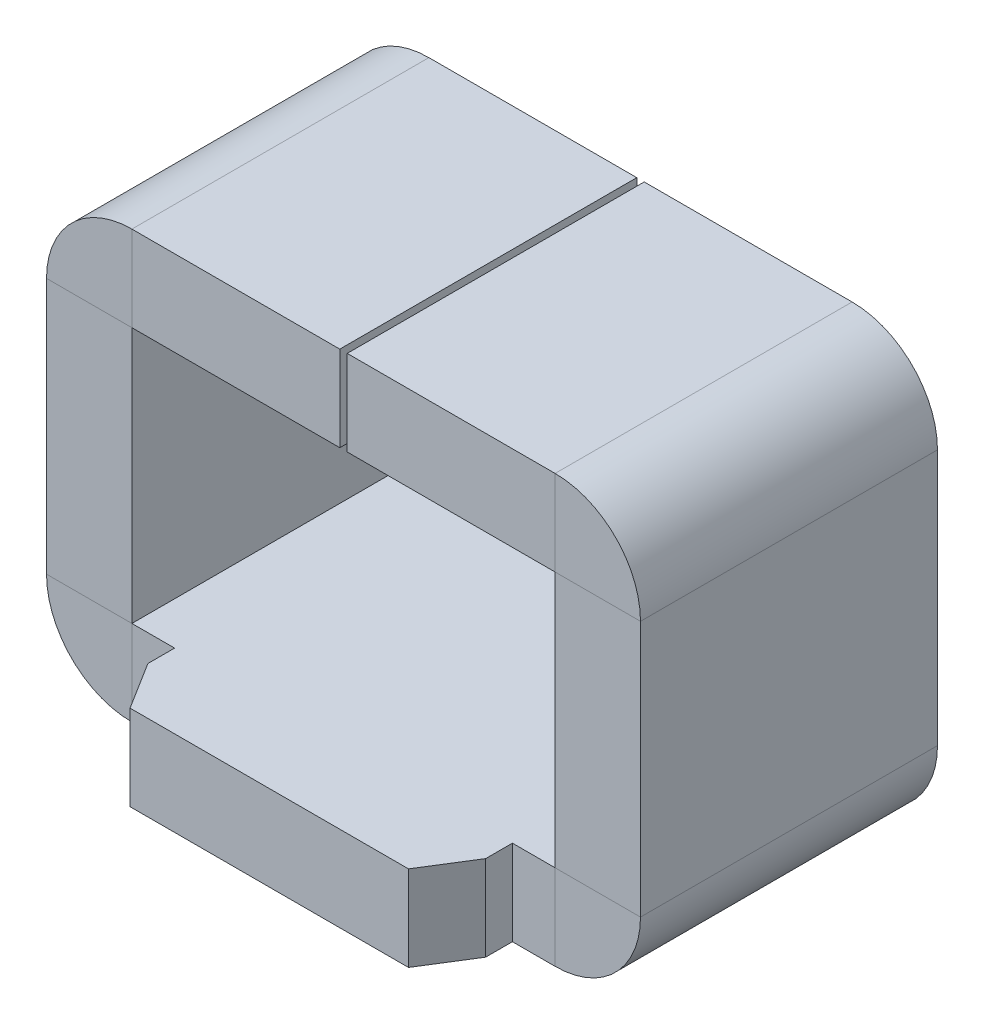
ISO-10303-21;
HEADER;
FILE_DESCRIPTION(('STEP AP214'),'2;1');
FILE_NAME('part.step','',(''),(''),'','','');
FILE_SCHEMA(('AUTOMOTIVE_DESIGN { 1 0 10303 214 1 1 1 1 }'));
ENDSEC;
DATA;
#1=APPLICATION_CONTEXT('core data for automotive mechanical design processes');
#2=APPLICATION_PROTOCOL_DEFINITION('international standard','automotive_design',2000,#1);
#3=PRODUCT_CONTEXT('',#1,'mechanical');
#4=PRODUCT('Part','Part','',(#3));
#5=PRODUCT_RELATED_PRODUCT_CATEGORY('part','',(#4));
#6=PRODUCT_DEFINITION_FORMATION('','',#4);
#7=PRODUCT_DEFINITION_CONTEXT('part definition',#1,'design');
#8=PRODUCT_DEFINITION('design','',#6,#7);
#9=PRODUCT_DEFINITION_SHAPE('','',#8);
#10=(LENGTH_UNIT() NAMED_UNIT(*) SI_UNIT(.MILLI.,.METRE.));
#11=(NAMED_UNIT(*) PLANE_ANGLE_UNIT() SI_UNIT($,.RADIAN.));
#12=(NAMED_UNIT(*) SI_UNIT($,.STERADIAN.) SOLID_ANGLE_UNIT());
#13=UNCERTAINTY_MEASURE_WITH_UNIT(LENGTH_MEASURE(1.E-05),#10,'distance_accuracy_value','');
#14=(GEOMETRIC_REPRESENTATION_CONTEXT(3) GLOBAL_UNCERTAINTY_ASSIGNED_CONTEXT((#13)) GLOBAL_UNIT_ASSIGNED_CONTEXT((#10,
#11,#12)) REPRESENTATION_CONTEXT('',''));
#15=CARTESIAN_POINT('',(0.,0.,0.));
#16=DIRECTION('',(0.,0.,1.));
#17=DIRECTION('',(1.,0.,0.));
#18=AXIS2_PLACEMENT_3D('',#15,#16,#17);
#19=CARTESIAN_POINT('',(1.6,0.229999999999999,0.));
#20=DIRECTION('',(0.,0.,-1.));
#21=DIRECTION('',(-1.,0.,0.));
#22=AXIS2_PLACEMENT_3D('',#19,#20,#21);
#23=PLANE('',#22);
#24=DIRECTION('',(-1.,0.,0.));
#25=VECTOR('',#24,1.);
#26=CARTESIAN_POINT('',(1.6,0.919999999999998,0.));
#27=LINE('',#26,#25);
#28=CARTESIAN_POINT('',(1.6,0.919999999999998,0.));
#29=VERTEX_POINT('',#28);
#30=CARTESIAN_POINT('',(1.37,0.920000000000001,0.));
#31=VERTEX_POINT('',#30);
#32=EDGE_CURVE('E352',#29,#31,#27,.T.);
#33=ORIENTED_EDGE('',*,*,#32,.T.);
#34=DIRECTION('',(0.,1.,0.));
#35=VECTOR('',#34,1.);
#36=CARTESIAN_POINT('',(1.37,0.23,0.));
#37=LINE('',#36,#35);
#38=CARTESIAN_POINT('',(1.37,0.23,0.));
#39=VERTEX_POINT('',#38);
#40=EDGE_CURVE('E452',#31,#39,#37,.F.);
#41=ORIENTED_EDGE('',*,*,#40,.T.);
#42=DIRECTION('',(-1.,0.,0.));
#43=VECTOR('',#42,1.);
#44=CARTESIAN_POINT('',(1.6,0.229999999999999,0.));
#45=LINE('',#44,#43);
#46=CARTESIAN_POINT('',(1.6,0.229999999999999,0.));
#47=VERTEX_POINT('',#46);
#48=EDGE_CURVE('E453',#47,#39,#45,.T.);
#49=ORIENTED_EDGE('',*,*,#48,.F.);
#50=DIRECTION('',(0.,-1.,0.));
#51=VECTOR('',#50,1.);
#52=CARTESIAN_POINT('',(1.6,0.,0.));
#53=LINE('',#52,#51);
#54=EDGE_CURVE('E466',#29,#47,#53,.T.);
#55=ORIENTED_EDGE('',*,*,#54,.F.);
#56=EDGE_LOOP('',(#33,#41,#49,#55));
#57=FACE_BOUND('',#56,.T.);
#58=ADVANCED_FACE('F119',(#57),#23,.F.);
#59=CARTESIAN_POINT('',(1.6,1.15,-0.8));
#60=DIRECTION('',(0.,0.,1.));
#61=DIRECTION('',(1.,0.,0.));
#62=AXIS2_PLACEMENT_3D('',#59,#60,#61);
#63=PLANE('',#62);
#64=DIRECTION('',(-1.,0.,0.));
#65=VECTOR('',#64,1.);
#66=CARTESIAN_POINT('',(1.6,0.919999999999998,-0.8));
#67=LINE('',#66,#65);
#68=CARTESIAN_POINT('',(1.6,0.92,-0.8));
#69=VERTEX_POINT('',#68);
#70=CARTESIAN_POINT('',(1.37,0.920000000000001,-0.8));
#71=VERTEX_POINT('',#70);
#72=EDGE_CURVE('E347',#69,#71,#67,.T.);
#73=ORIENTED_EDGE('',*,*,#72,.F.);
#74=DIRECTION('',(0.,1.,0.));
#75=VECTOR('',#74,1.);
#76=CARTESIAN_POINT('',(1.6,0.,-0.8));
#77=LINE('',#76,#75);
#78=CARTESIAN_POINT('',(1.6,0.229999999999999,-0.8));
#79=VERTEX_POINT('',#78);
#80=EDGE_CURVE('E460',#79,#69,#77,.T.);
#81=ORIENTED_EDGE('',*,*,#80,.F.);
#82=DIRECTION('',(-1.,0.,0.));
#83=VECTOR('',#82,1.);
#84=CARTESIAN_POINT('',(1.6,0.229999999999999,-0.8));
#85=LINE('',#84,#83);
#86=CARTESIAN_POINT('',(1.37,0.23,-0.8));
#87=VERTEX_POINT('',#86);
#88=EDGE_CURVE('E457',#79,#87,#85,.T.);
#89=ORIENTED_EDGE('',*,*,#88,.T.);
#90=DIRECTION('',(0.,-1.,0.));
#91=VECTOR('',#90,1.);
#92=CARTESIAN_POINT('',(1.37,1.15,-0.8));
#93=LINE('',#92,#91);
#94=EDGE_CURVE('E468',#87,#71,#93,.F.);
#95=ORIENTED_EDGE('',*,*,#94,.T.);
#96=EDGE_LOOP('',(#73,#81,#89,#95));
#97=FACE_BOUND('',#96,.T.);
#98=ADVANCED_FACE('F701',(#97),#63,.F.);
#99=CARTESIAN_POINT('',(1.6,0.,0.));
#100=DIRECTION('',(-1.,0.,0.));
#101=DIRECTION('',(0.,-1.,0.));
#102=AXIS2_PLACEMENT_3D('',#99,#100,#101);
#103=PLANE('',#102);
#104=DIRECTION('',(0.,0.,-1.));
#105=VECTOR('',#104,1.);
#106=CARTESIAN_POINT('',(1.6,0.919999999999998,0.));
#107=LINE('',#106,#105);
#108=EDGE_CURVE('E349',#29,#69,#107,.T.);
#109=ORIENTED_EDGE('',*,*,#108,.F.);
#110=ORIENTED_EDGE('',*,*,#54,.T.);
#111=DIRECTION('',(0.,0.,-1.));
#112=VECTOR('',#111,1.);
#113=CARTESIAN_POINT('',(1.6,0.229999999999999,0.));
#114=LINE('',#113,#112);
#115=EDGE_CURVE('E463',#47,#79,#114,.T.);
#116=ORIENTED_EDGE('',*,*,#115,.T.);
#117=ORIENTED_EDGE('',*,*,#80,.T.);
#118=EDGE_LOOP('',(#109,#110,#116,#117));
#119=FACE_BOUND('',#118,.T.);
#120=ADVANCED_FACE('F707',(#119),#103,.F.);
#121=CARTESIAN_POINT('',(1.37,0.,0.));
#122=DIRECTION('',(-1.,0.,0.));
#123=DIRECTION('',(0.,-1.,0.));
#124=AXIS2_PLACEMENT_3D('',#121,#122,#123);
#125=PLANE('',#124);
#126=ORIENTED_EDGE('',*,*,#40,.F.);
#127=DIRECTION('',(0.,0.,1.));
#128=VECTOR('',#127,1.);
#129=CARTESIAN_POINT('',(1.37,0.920000000000001,-0.8));
#130=LINE('',#129,#128);
#131=EDGE_CURVE('E338',#31,#71,#130,.F.);
#132=ORIENTED_EDGE('',*,*,#131,.T.);
#133=ORIENTED_EDGE('',*,*,#94,.F.);
#134=DIRECTION('',(0.,0.,1.));
#135=VECTOR('',#134,1.);
#136=CARTESIAN_POINT('',(1.37,0.23,0.));
#137=LINE('',#136,#135);
#138=EDGE_CURVE('E471',#39,#87,#137,.F.);
#139=ORIENTED_EDGE('',*,*,#138,.F.);
#140=EDGE_LOOP('',(#126,#132,#133,#139));
#141=FACE_BOUND('',#140,.T.);
#142=ADVANCED_FACE('F781',(#141),#125,.T.);
#143=CARTESIAN_POINT('',(0.,0.229999999999999,-0.8));
#144=DIRECTION('',(0.,0.,1.));
#145=DIRECTION('',(1.,0.,0.));
#146=AXIS2_PLACEMENT_3D('',#143,#144,#145);
#147=PLANE('',#146);
#148=DIRECTION('',(1.,0.,0.));
#149=VECTOR('',#148,1.);
#150=CARTESIAN_POINT('',(0.,0.919999999999999,-0.8));
#151=LINE('',#150,#149);
#152=CARTESIAN_POINT('',(0.,0.919999999999999,-0.8));
#153=VERTEX_POINT('',#152);
#154=CARTESIAN_POINT('',(0.229999999999998,0.920000000000001,-0.8));
#155=VERTEX_POINT('',#154);
#156=EDGE_CURVE('E397',#153,#155,#151,.T.);
#157=ORIENTED_EDGE('',*,*,#156,.T.);
#158=DIRECTION('',(0.,1.,0.));
#159=VECTOR('',#158,1.);
#160=CARTESIAN_POINT('',(0.23,0.23,-0.8));
#161=LINE('',#160,#159);
#162=CARTESIAN_POINT('',(0.23,0.23,-0.8));
#163=VERTEX_POINT('',#162);
#164=EDGE_CURVE('E403',#155,#163,#161,.F.);
#165=ORIENTED_EDGE('',*,*,#164,.T.);
#166=DIRECTION('',(1.,0.,0.));
#167=VECTOR('',#166,1.);
#168=CARTESIAN_POINT('',(0.,0.229999999999999,-0.8));
#169=LINE('',#168,#167);
#170=CARTESIAN_POINT('',(0.,0.229999999999999,-0.8));
#171=VERTEX_POINT('',#170);
#172=EDGE_CURVE('E404',#171,#163,#169,.T.);
#173=ORIENTED_EDGE('',*,*,#172,.F.);
#174=DIRECTION('',(0.,-1.,0.));
#175=VECTOR('',#174,1.);
#176=CARTESIAN_POINT('',(0.,0.,-0.8));
#177=LINE('',#176,#175);
#178=EDGE_CURVE('E417',#153,#171,#177,.T.);
#179=ORIENTED_EDGE('',*,*,#178,.F.);
#180=EDGE_LOOP('',(#157,#165,#173,#179));
#181=FACE_BOUND('',#180,.T.);
#182=ADVANCED_FACE('F686',(#181),#147,.F.);
#183=CARTESIAN_POINT('',(0.,1.15,0.));
#184=DIRECTION('',(0.,0.,-1.));
#185=DIRECTION('',(-1.,0.,0.));
#186=AXIS2_PLACEMENT_3D('',#183,#184,#185);
#187=PLANE('',#186);
#188=DIRECTION('',(1.,0.,0.));
#189=VECTOR('',#188,1.);
#190=CARTESIAN_POINT('',(0.,0.919999999999999,0.));
#191=LINE('',#190,#189);
#192=CARTESIAN_POINT('',(0.,0.92,0.));
#193=VERTEX_POINT('',#192);
#194=CARTESIAN_POINT('',(0.229999999999998,0.920000000000001,0.));
#195=VERTEX_POINT('',#194);
#196=EDGE_CURVE('E362',#193,#195,#191,.T.);
#197=ORIENTED_EDGE('',*,*,#196,.F.);
#198=DIRECTION('',(0.,1.,0.));
#199=VECTOR('',#198,1.);
#200=CARTESIAN_POINT('',(0.,0.,0.));
#201=LINE('',#200,#199);
#202=CARTESIAN_POINT('',(0.,0.229999999999999,0.));
#203=VERTEX_POINT('',#202);
#204=EDGE_CURVE('E411',#203,#193,#201,.T.);
#205=ORIENTED_EDGE('',*,*,#204,.F.);
#206=DIRECTION('',(1.,0.,0.));
#207=VECTOR('',#206,1.);
#208=CARTESIAN_POINT('',(0.,0.229999999999999,0.));
#209=LINE('',#208,#207);
#210=CARTESIAN_POINT('',(0.23,0.23,0.));
#211=VERTEX_POINT('',#210);
#212=EDGE_CURVE('E408',#203,#211,#209,.T.);
#213=ORIENTED_EDGE('',*,*,#212,.T.);
#214=DIRECTION('',(0.,-1.,0.));
#215=VECTOR('',#214,1.);
#216=CARTESIAN_POINT('',(0.229999999999997,1.15,0.));
#217=LINE('',#216,#215);
#218=EDGE_CURVE('E419',#211,#195,#217,.F.);
#219=ORIENTED_EDGE('',*,*,#218,.T.);
#220=EDGE_LOOP('',(#197,#205,#213,#219));
#221=FACE_BOUND('',#220,.T.);
#222=ADVANCED_FACE('F655',(#221),#187,.F.);
#223=CARTESIAN_POINT('',(0.,0.,0.));
#224=DIRECTION('',(1.,0.,0.));
#225=DIRECTION('',(0.,1.,0.));
#226=AXIS2_PLACEMENT_3D('',#223,#224,#225);
#227=PLANE('',#226);
#228=DIRECTION('',(0.,0.,1.));
#229=VECTOR('',#228,1.);
#230=CARTESIAN_POINT('',(0.,0.919999999999999,0.));
#231=LINE('',#230,#229);
#232=EDGE_CURVE('E394',#153,#193,#231,.T.);
#233=ORIENTED_EDGE('',*,*,#232,.F.);
#234=ORIENTED_EDGE('',*,*,#178,.T.);
#235=DIRECTION('',(0.,0.,1.));
#236=VECTOR('',#235,1.);
#237=CARTESIAN_POINT('',(0.,0.229999999999999,0.));
#238=LINE('',#237,#236);
#239=EDGE_CURVE('E414',#171,#203,#238,.T.);
#240=ORIENTED_EDGE('',*,*,#239,.T.);
#241=ORIENTED_EDGE('',*,*,#204,.T.);
#242=EDGE_LOOP('',(#233,#234,#240,#241));
#243=FACE_BOUND('',#242,.T.);
#244=ADVANCED_FACE('F684',(#243),#227,.F.);
#245=CARTESIAN_POINT('',(0.230000000000001,0.,0.));
#246=DIRECTION('',(1.,0.,0.));
#247=DIRECTION('',(0.,1.,0.));
#248=AXIS2_PLACEMENT_3D('',#245,#246,#247);
#249=PLANE('',#248);
#250=ORIENTED_EDGE('',*,*,#164,.F.);
#251=DIRECTION('',(0.,0.,-1.));
#252=VECTOR('',#251,1.);
#253=CARTESIAN_POINT('',(0.229999999999998,0.920000000000001,0.));
#254=LINE('',#253,#252);
#255=EDGE_CURVE('E383',#155,#195,#254,.F.);
#256=ORIENTED_EDGE('',*,*,#255,.T.);
#257=ORIENTED_EDGE('',*,*,#218,.F.);
#258=DIRECTION('',(0.,0.,-1.));
#259=VECTOR('',#258,1.);
#260=CARTESIAN_POINT('',(0.23,0.23,-0.8));
#261=LINE('',#260,#259);
#262=EDGE_CURVE('E422',#163,#211,#261,.F.);
#263=ORIENTED_EDGE('',*,*,#262,.F.);
#264=EDGE_LOOP('',(#250,#256,#257,#263));
#265=FACE_BOUND('',#264,.T.);
#266=ADVANCED_FACE('F656',(#265),#249,.T.);
#267=CARTESIAN_POINT('',(0.,0.23,0.));
#268=DIRECTION('',(0.,-1.,0.));
#269=DIRECTION('',(0.,0.,-1.));
#270=AXIS2_PLACEMENT_3D('',#267,#268,#269);
#271=PLANE('',#270);
#272=DIRECTION('',(0.,0.,-1.));
#273=VECTOR('',#272,1.);
#274=CARTESIAN_POINT('',(0.345,0.23,0.115));
#275=LINE('',#274,#273);
#276=CARTESIAN_POINT('',(0.345,0.23,0.0719999999999995));
#277=VERTEX_POINT('',#276);
#278=CARTESIAN_POINT('',(0.345,0.23,0.));
#279=VERTEX_POINT('',#278);
#280=EDGE_CURVE('E438',#277,#279,#275,.T.);
#281=ORIENTED_EDGE('',*,*,#280,.F.);
#282=DIRECTION('',(0.529998940003179,0.,0.847998304005088));
#283=VECTOR('',#282,1.);
#284=CARTESIAN_POINT('',(0.425,0.23,0.2));
#285=LINE('',#284,#283);
#286=CARTESIAN_POINT('',(0.425,0.23,0.2));
#287=VERTEX_POINT('',#286);
#288=EDGE_CURVE('E503',#277,#287,#285,.T.);
#289=ORIENTED_EDGE('',*,*,#288,.T.);
#290=DIRECTION('',(1.,0.,0.));
#291=VECTOR('',#290,1.);
#292=CARTESIAN_POINT('',(1.175,0.23,0.2));
#293=LINE('',#292,#291);
#294=CARTESIAN_POINT('',(1.175,0.23,0.2));
#295=VERTEX_POINT('',#294);
#296=EDGE_CURVE('E506',#287,#295,#293,.T.);
#297=ORIENTED_EDGE('',*,*,#296,.T.);
#298=DIRECTION('',(0.52999894000318,0.,-0.847998304005088));
#299=VECTOR('',#298,1.);
#300=CARTESIAN_POINT('',(1.3,0.23,0.));
#301=LINE('',#300,#299);
#302=CARTESIAN_POINT('',(1.255,0.23,0.0719999999999996));
#303=VERTEX_POINT('',#302);
#304=EDGE_CURVE('E508',#295,#303,#301,.T.);
#305=ORIENTED_EDGE('',*,*,#304,.T.);
#306=DIRECTION('',(0.,0.,1.));
#307=VECTOR('',#306,1.);
#308=CARTESIAN_POINT('',(1.255,0.23,0.));
#309=LINE('',#308,#307);
#310=CARTESIAN_POINT('',(1.255,0.23,0.));
#311=VERTEX_POINT('',#310);
#312=EDGE_CURVE('E493',#311,#303,#309,.T.);
#313=ORIENTED_EDGE('',*,*,#312,.F.);
#314=DIRECTION('',(1.,0.,0.));
#315=VECTOR('',#314,1.);
#316=CARTESIAN_POINT('',(1.3,0.23,0.));
#317=LINE('',#316,#315);
#318=EDGE_CURVE('E511',#311,#39,#317,.T.);
#319=ORIENTED_EDGE('',*,*,#318,.T.);
#320=ORIENTED_EDGE('',*,*,#138,.T.);
#321=DIRECTION('',(-1.,0.,0.));
#322=VECTOR('',#321,1.);
#323=CARTESIAN_POINT('',(1.3,0.23,-0.8));
#324=LINE('',#323,#322);
#325=CARTESIAN_POINT('',(1.255,0.23,-0.8));
#326=VERTEX_POINT('',#325);
#327=EDGE_CURVE('E514',#87,#326,#324,.T.);
#328=ORIENTED_EDGE('',*,*,#327,.T.);
#329=DIRECTION('',(0.,0.,1.));
#330=VECTOR('',#329,1.);
#331=CARTESIAN_POINT('',(1.255,0.23,-0.915));
#332=LINE('',#331,#330);
#333=CARTESIAN_POINT('',(1.255,0.23,-0.872));
#334=VERTEX_POINT('',#333);
#335=EDGE_CURVE('E488',#334,#326,#332,.T.);
#336=ORIENTED_EDGE('',*,*,#335,.F.);
#337=DIRECTION('',(-0.52999894000318,0.,-0.847998304005088));
#338=VECTOR('',#337,1.);
#339=CARTESIAN_POINT('',(1.3,0.23,-0.8));
#340=LINE('',#339,#338);
#341=CARTESIAN_POINT('',(1.175,0.23,-1.));
#342=VERTEX_POINT('',#341);
#343=EDGE_CURVE('E516',#334,#342,#340,.T.);
#344=ORIENTED_EDGE('',*,*,#343,.T.);
#345=DIRECTION('',(-1.,0.,0.));
#346=VECTOR('',#345,1.);
#347=CARTESIAN_POINT('',(1.175,0.23,-1.));
#348=LINE('',#347,#346);
#349=CARTESIAN_POINT('',(0.425,0.23,-1.));
#350=VERTEX_POINT('',#349);
#351=EDGE_CURVE('E518',#342,#350,#348,.T.);
#352=ORIENTED_EDGE('',*,*,#351,.T.);
#353=DIRECTION('',(-0.52999894000318,0.,0.847998304005088));
#354=VECTOR('',#353,1.);
#355=CARTESIAN_POINT('',(0.425,0.23,-1.));
#356=LINE('',#355,#354);
#357=CARTESIAN_POINT('',(0.345,0.23,-0.872));
#358=VERTEX_POINT('',#357);
#359=EDGE_CURVE('E520',#350,#358,#356,.T.);
#360=ORIENTED_EDGE('',*,*,#359,.T.);
#361=DIRECTION('',(0.,0.,-1.));
#362=VECTOR('',#361,1.);
#363=CARTESIAN_POINT('',(0.345,0.23,-0.8));
#364=LINE('',#363,#362);
#365=CARTESIAN_POINT('',(0.345,0.23,-0.8));
#366=VERTEX_POINT('',#365);
#367=EDGE_CURVE('E442',#366,#358,#364,.T.);
#368=ORIENTED_EDGE('',*,*,#367,.F.);
#369=DIRECTION('',(-1.,0.,0.));
#370=VECTOR('',#369,1.);
#371=CARTESIAN_POINT('',(0.,0.23,-0.8));
#372=LINE('',#371,#370);
#373=EDGE_CURVE('E523',#366,#163,#372,.T.);
#374=ORIENTED_EDGE('',*,*,#373,.T.);
#375=ORIENTED_EDGE('',*,*,#262,.T.);
#376=DIRECTION('',(1.,0.,0.));
#377=VECTOR('',#376,1.);
#378=CARTESIAN_POINT('',(0.,0.23,0.));
#379=LINE('',#378,#377);
#380=EDGE_CURVE('E134',#211,#279,#379,.T.);
#381=ORIENTED_EDGE('',*,*,#380,.T.);
#382=EDGE_LOOP('',(#281,#289,#297,#305,#313,#319,#320,#328,#336,#344,#352,#360,#368,#374,#375,#381));
#383=FACE_BOUND('',#382,.T.);
#384=ADVANCED_FACE('F593',(#383),#271,.F.);
#385=CARTESIAN_POINT('',(0.,0.,0.));
#386=DIRECTION('',(0.,-1.,0.));
#387=DIRECTION('',(0.,0.,-1.));
#388=AXIS2_PLACEMENT_3D('',#385,#386,#387);
#389=PLANE('',#388);
#390=DIRECTION('',(0.529998940003179,0.,0.847998304005088));
#391=VECTOR('',#390,1.);
#392=CARTESIAN_POINT('',(0.425,0.,0.2));
#393=LINE('',#392,#391);
#394=CARTESIAN_POINT('',(0.345,0.,0.0719999999999995));
#395=VERTEX_POINT('',#394);
#396=CARTESIAN_POINT('',(0.425,0.,0.2));
#397=VERTEX_POINT('',#396);
#398=EDGE_CURVE('E528',#395,#397,#393,.T.);
#399=ORIENTED_EDGE('',*,*,#398,.F.);
#400=DIRECTION('',(0.,0.,-1.));
#401=VECTOR('',#400,1.);
#402=CARTESIAN_POINT('',(0.345,0.,0.));
#403=LINE('',#402,#401);
#404=CARTESIAN_POINT('',(0.345,0.,0.));
#405=VERTEX_POINT('',#404);
#406=EDGE_CURVE('E450',#395,#405,#403,.T.);
#407=ORIENTED_EDGE('',*,*,#406,.T.);
#408=DIRECTION('',(1.,0.,0.));
#409=VECTOR('',#408,1.);
#410=CARTESIAN_POINT('',(0.,0.,0.));
#411=LINE('',#410,#409);
#412=CARTESIAN_POINT('',(0.23,0.,0.));
#413=VERTEX_POINT('',#412);
#414=EDGE_CURVE('E142',#413,#405,#411,.T.);
#415=ORIENTED_EDGE('',*,*,#414,.F.);
#416=DIRECTION('',(0.,0.,1.));
#417=VECTOR('',#416,1.);
#418=CARTESIAN_POINT('',(0.230000000000002,0.,0.));
#419=LINE('',#418,#417);
#420=CARTESIAN_POINT('',(0.230000000000002,0.,-0.8));
#421=VERTEX_POINT('',#420);
#422=EDGE_CURVE('E426',#421,#413,#419,.T.);
#423=ORIENTED_EDGE('',*,*,#422,.F.);
#424=DIRECTION('',(-1.,0.,0.));
#425=VECTOR('',#424,1.);
#426=CARTESIAN_POINT('',(0.,0.,-0.8));
#427=LINE('',#426,#425);
#428=CARTESIAN_POINT('',(0.345,0.,-0.8));
#429=VERTEX_POINT('',#428);
#430=EDGE_CURVE('E504',#429,#421,#427,.T.);
#431=ORIENTED_EDGE('',*,*,#430,.F.);
#432=DIRECTION('',(0.,0.,-1.));
#433=VECTOR('',#432,1.);
#434=CARTESIAN_POINT('',(0.345,0.,0.));
#435=LINE('',#434,#433);
#436=CARTESIAN_POINT('',(0.345,0.,-0.872));
#437=VERTEX_POINT('',#436);
#438=EDGE_CURVE('E440',#429,#437,#435,.T.);
#439=ORIENTED_EDGE('',*,*,#438,.T.);
#440=DIRECTION('',(-0.52999894000318,0.,0.847998304005088));
#441=VECTOR('',#440,1.);
#442=CARTESIAN_POINT('',(0.425,0.,-1.));
#443=LINE('',#442,#441);
#444=CARTESIAN_POINT('',(0.425,0.,-1.));
#445=VERTEX_POINT('',#444);
#446=EDGE_CURVE('E543',#445,#437,#443,.T.);
#447=ORIENTED_EDGE('',*,*,#446,.F.);
#448=DIRECTION('',(-1.,0.,0.));
#449=VECTOR('',#448,1.);
#450=CARTESIAN_POINT('',(1.175,0.,-1.));
#451=LINE('',#450,#449);
#452=CARTESIAN_POINT('',(1.175,0.,-1.));
#453=VERTEX_POINT('',#452);
#454=EDGE_CURVE('E541',#453,#445,#451,.T.);
#455=ORIENTED_EDGE('',*,*,#454,.F.);
#456=DIRECTION('',(-0.52999894000318,0.,-0.847998304005088));
#457=VECTOR('',#456,1.);
#458=CARTESIAN_POINT('',(1.3,0.,-0.8));
#459=LINE('',#458,#457);
#460=CARTESIAN_POINT('',(1.255,0.,-0.872));
#461=VERTEX_POINT('',#460);
#462=EDGE_CURVE('E539',#461,#453,#459,.T.);
#463=ORIENTED_EDGE('',*,*,#462,.F.);
#464=DIRECTION('',(0.,0.,1.));
#465=VECTOR('',#464,1.);
#466=CARTESIAN_POINT('',(1.255,0.,0.));
#467=LINE('',#466,#465);
#468=CARTESIAN_POINT('',(1.255,0.,-0.8));
#469=VERTEX_POINT('',#468);
#470=EDGE_CURVE('E562',#461,#469,#467,.T.);
#471=ORIENTED_EDGE('',*,*,#470,.T.);
#472=DIRECTION('',(-1.,0.,0.));
#473=VECTOR('',#472,1.);
#474=CARTESIAN_POINT('',(1.3,0.,-0.8));
#475=LINE('',#474,#473);
#476=CARTESIAN_POINT('',(1.37,0.,-0.8));
#477=VERTEX_POINT('',#476);
#478=EDGE_CURVE('E537',#477,#469,#475,.T.);
#479=ORIENTED_EDGE('',*,*,#478,.F.);
#480=DIRECTION('',(0.,0.,-1.));
#481=VECTOR('',#480,1.);
#482=CARTESIAN_POINT('',(1.37,0.,0.));
#483=LINE('',#482,#481);
#484=CARTESIAN_POINT('',(1.37,0.,0.));
#485=VERTEX_POINT('',#484);
#486=EDGE_CURVE('E476',#485,#477,#483,.T.);
#487=ORIENTED_EDGE('',*,*,#486,.F.);
#488=DIRECTION('',(1.,0.,0.));
#489=VECTOR('',#488,1.);
#490=CARTESIAN_POINT('',(1.3,0.,0.));
#491=LINE('',#490,#489);
#492=CARTESIAN_POINT('',(1.255,0.,0.));
#493=VERTEX_POINT('',#492);
#494=EDGE_CURVE('E535',#493,#485,#491,.T.);
#495=ORIENTED_EDGE('',*,*,#494,.F.);
#496=DIRECTION('',(0.,0.,1.));
#497=VECTOR('',#496,1.);
#498=CARTESIAN_POINT('',(1.255,0.,0.));
#499=LINE('',#498,#497);
#500=CARTESIAN_POINT('',(1.255,0.,0.0719999999999996));
#501=VERTEX_POINT('',#500);
#502=EDGE_CURVE('E559',#493,#501,#499,.T.);
#503=ORIENTED_EDGE('',*,*,#502,.T.);
#504=DIRECTION('',(0.52999894000318,0.,-0.847998304005088));
#505=VECTOR('',#504,1.);
#506=CARTESIAN_POINT('',(1.3,0.,0.));
#507=LINE('',#506,#505);
#508=CARTESIAN_POINT('',(1.175,0.,0.2));
#509=VERTEX_POINT('',#508);
#510=EDGE_CURVE('E532',#509,#501,#507,.T.);
#511=ORIENTED_EDGE('',*,*,#510,.F.);
#512=DIRECTION('',(1.,0.,0.));
#513=VECTOR('',#512,1.);
#514=CARTESIAN_POINT('',(1.175,0.,0.2));
#515=LINE('',#514,#513);
#516=EDGE_CURVE('E530',#397,#509,#515,.T.);
#517=ORIENTED_EDGE('',*,*,#516,.F.);
#518=EDGE_LOOP('',(#399,#407,#415,#423,#431,#439,#447,#455,#463,#471,#479,#487,#495,#503,#511,#517));
#519=FACE_BOUND('',#518,.T.);
#520=ADVANCED_FACE('F575',(#519),#389,.T.);
#521=CARTESIAN_POINT('',(0.,0.23,0.));
#522=DIRECTION('',(0.,0.,-1.));
#523=DIRECTION('',(-1.,0.,0.));
#524=AXIS2_PLACEMENT_3D('',#521,#522,#523);
#525=PLANE('',#524);
#526=DIRECTION('',(0.,1.,0.));
#527=VECTOR('',#526,1.);
#528=CARTESIAN_POINT('',(0.230000000000002,0.,0.));
#529=LINE('',#528,#527);
#530=EDGE_CURVE('E407',#413,#211,#529,.T.);
#531=ORIENTED_EDGE('',*,*,#530,.F.);
#532=ORIENTED_EDGE('',*,*,#414,.T.);
#533=DIRECTION('',(0.,-1.,0.));
#534=VECTOR('',#533,1.);
#535=CARTESIAN_POINT('',(0.345,0.23,0.));
#536=LINE('',#535,#534);
#537=EDGE_CURVE('E441',#279,#405,#536,.T.);
#538=ORIENTED_EDGE('',*,*,#537,.F.);
#539=ORIENTED_EDGE('',*,*,#380,.F.);
#540=EDGE_LOOP('',(#531,#532,#538,#539));
#541=FACE_BOUND('',#540,.T.);
#542=ADVANCED_FACE('F121',(#541),#525,.F.);
#543=CARTESIAN_POINT('',(0.425,0.23,0.2));
#544=DIRECTION('',(0.847998304005088,0.,-0.529998940003179));
#545=DIRECTION('',(-0.529998940003179,0.,-0.847998304005088));
#546=AXIS2_PLACEMENT_3D('',#543,#544,#545);
#547=PLANE('',#546);
#548=DIRECTION('',(0.,1.,0.));
#549=VECTOR('',#548,1.);
#550=CARTESIAN_POINT('',(0.345,0.23,0.0719999999999995));
#551=LINE('',#550,#549);
#552=EDGE_CURVE('E13',#395,#277,#551,.T.);
#553=ORIENTED_EDGE('',*,*,#552,.F.);
#554=ORIENTED_EDGE('',*,*,#398,.T.);
#555=DIRECTION('',(0.,-1.,0.));
#556=VECTOR('',#555,1.);
#557=CARTESIAN_POINT('',(0.425,0.23,0.2));
#558=LINE('',#557,#556);
#559=EDGE_CURVE('E556',#287,#397,#558,.T.);
#560=ORIENTED_EDGE('',*,*,#559,.F.);
#561=ORIENTED_EDGE('',*,*,#288,.F.);
#562=EDGE_LOOP('',(#553,#554,#560,#561));
#563=FACE_BOUND('',#562,.T.);
#564=ADVANCED_FACE('F632',(#563),#547,.F.);
#565=CARTESIAN_POINT('',(0.425,0.23,-1.));
#566=DIRECTION('',(0.847998304005088,0.,0.52999894000318));
#567=DIRECTION('',(0.52999894000318,0.,-0.847998304005088));
#568=AXIS2_PLACEMENT_3D('',#565,#566,#567);
#569=PLANE('',#568);
#570=DIRECTION('',(0.,-1.,0.));
#571=VECTOR('',#570,1.);
#572=CARTESIAN_POINT('',(0.345,0.23,-0.872));
#573=LINE('',#572,#571);
#574=EDGE_CURVE('E127',#358,#437,#573,.T.);
#575=ORIENTED_EDGE('',*,*,#574,.F.);
#576=ORIENTED_EDGE('',*,*,#359,.F.);
#577=DIRECTION('',(0.,-1.,0.));
#578=VECTOR('',#577,1.);
#579=CARTESIAN_POINT('',(0.425,0.23,-1.));
#580=LINE('',#579,#578);
#581=EDGE_CURVE('E526',#350,#445,#580,.T.);
#582=ORIENTED_EDGE('',*,*,#581,.T.);
#583=ORIENTED_EDGE('',*,*,#446,.T.);
#584=EDGE_LOOP('',(#575,#576,#582,#583));
#585=FACE_BOUND('',#584,.T.);
#586=ADVANCED_FACE('F577',(#585),#569,.F.);
#587=CARTESIAN_POINT('',(0.,0.23,-0.8));
#588=DIRECTION('',(0.,0.,1.));
#589=DIRECTION('',(1.,0.,0.));
#590=AXIS2_PLACEMENT_3D('',#587,#588,#589);
#591=PLANE('',#590);
#592=DIRECTION('',(0.,1.,0.));
#593=VECTOR('',#592,1.);
#594=CARTESIAN_POINT('',(0.230000000000002,0.,-0.8));
#595=LINE('',#594,#593);
#596=EDGE_CURVE('E429',#421,#163,#595,.T.);
#597=ORIENTED_EDGE('',*,*,#596,.T.);
#598=ORIENTED_EDGE('',*,*,#373,.F.);
#599=DIRECTION('',(0.,-1.,0.));
#600=VECTOR('',#599,1.);
#601=CARTESIAN_POINT('',(0.345,0.23,-0.8));
#602=LINE('',#601,#600);
#603=EDGE_CURVE('E437',#366,#429,#602,.T.);
#604=ORIENTED_EDGE('',*,*,#603,.T.);
#605=ORIENTED_EDGE('',*,*,#430,.T.);
#606=EDGE_LOOP('',(#597,#598,#604,#605));
#607=FACE_BOUND('',#606,.T.);
#608=ADVANCED_FACE('F649',(#607),#591,.F.);
#609=CARTESIAN_POINT('',(1.3,0.23,0.));
#610=DIRECTION('',(-0.847998304005088,0.,-0.52999894000318));
#611=DIRECTION('',(-0.52999894000318,0.,0.847998304005088));
#612=AXIS2_PLACEMENT_3D('',#609,#610,#611);
#613=PLANE('',#612);
#614=DIRECTION('',(0.,-1.,0.));
#615=VECTOR('',#614,1.);
#616=CARTESIAN_POINT('',(1.255,0.23,0.0719999999999996));
#617=LINE('',#616,#615);
#618=EDGE_CURVE('E491',#303,#501,#617,.T.);
#619=ORIENTED_EDGE('',*,*,#618,.F.);
#620=ORIENTED_EDGE('',*,*,#304,.F.);
#621=DIRECTION('',(0.,-1.,0.));
#622=VECTOR('',#621,1.);
#623=CARTESIAN_POINT('',(1.175,0.23,0.2));
#624=LINE('',#623,#622);
#625=EDGE_CURVE('E553',#295,#509,#624,.T.);
#626=ORIENTED_EDGE('',*,*,#625,.T.);
#627=ORIENTED_EDGE('',*,*,#510,.T.);
#628=EDGE_LOOP('',(#619,#620,#626,#627));
#629=FACE_BOUND('',#628,.T.);
#630=ADVANCED_FACE('F621',(#629),#613,.F.);
#631=CARTESIAN_POINT('',(1.3,0.23,0.));
#632=DIRECTION('',(0.,0.,-1.));
#633=DIRECTION('',(-1.,0.,0.));
#634=AXIS2_PLACEMENT_3D('',#631,#632,#633);
#635=PLANE('',#634);
#636=DIRECTION('',(0.,1.,0.));
#637=VECTOR('',#636,1.);
#638=CARTESIAN_POINT('',(1.37,0.,0.));
#639=LINE('',#638,#637);
#640=EDGE_CURVE('E479',#485,#39,#639,.T.);
#641=ORIENTED_EDGE('',*,*,#640,.T.);
#642=ORIENTED_EDGE('',*,*,#318,.F.);
#643=DIRECTION('',(0.,-1.,0.));
#644=VECTOR('',#643,1.);
#645=CARTESIAN_POINT('',(1.255,0.23,0.));
#646=LINE('',#645,#644);
#647=EDGE_CURVE('E487',#311,#493,#646,.T.);
#648=ORIENTED_EDGE('',*,*,#647,.T.);
#649=ORIENTED_EDGE('',*,*,#494,.T.);
#650=EDGE_LOOP('',(#641,#642,#648,#649));
#651=FACE_BOUND('',#650,.T.);
#652=ADVANCED_FACE('F612',(#651),#635,.F.);
#653=CARTESIAN_POINT('',(1.3,0.23,-0.8));
#654=DIRECTION('',(0.,0.,1.));
#655=DIRECTION('',(1.,0.,0.));
#656=AXIS2_PLACEMENT_3D('',#653,#654,#655);
#657=PLANE('',#656);
#658=DIRECTION('',(0.,1.,0.));
#659=VECTOR('',#658,1.);
#660=CARTESIAN_POINT('',(1.37,0.,-0.8));
#661=LINE('',#660,#659);
#662=EDGE_CURVE('E456',#477,#87,#661,.T.);
#663=ORIENTED_EDGE('',*,*,#662,.F.);
#664=ORIENTED_EDGE('',*,*,#478,.T.);
#665=DIRECTION('',(0.,-1.,0.));
#666=VECTOR('',#665,1.);
#667=CARTESIAN_POINT('',(1.255,0.23,-0.8));
#668=LINE('',#667,#666);
#669=EDGE_CURVE('E492',#326,#469,#668,.T.);
#670=ORIENTED_EDGE('',*,*,#669,.F.);
#671=ORIENTED_EDGE('',*,*,#327,.F.);
#672=EDGE_LOOP('',(#663,#664,#670,#671));
#673=FACE_BOUND('',#672,.T.);
#674=ADVANCED_FACE('F597',(#673),#657,.F.);
#675=CARTESIAN_POINT('',(1.3,0.23,-0.8));
#676=DIRECTION('',(-0.847998304005088,0.,0.52999894000318));
#677=DIRECTION('',(0.52999894000318,0.,0.847998304005088));
#678=AXIS2_PLACEMENT_3D('',#675,#676,#677);
#679=PLANE('',#678);
#680=DIRECTION('',(0.,1.,0.));
#681=VECTOR('',#680,1.);
#682=CARTESIAN_POINT('',(1.255,0.23,-0.872));
#683=LINE('',#682,#681);
#684=EDGE_CURVE('E500',#461,#334,#683,.T.);
#685=ORIENTED_EDGE('',*,*,#684,.F.);
#686=ORIENTED_EDGE('',*,*,#462,.T.);
#687=DIRECTION('',(0.,-1.,0.));
#688=VECTOR('',#687,1.);
#689=CARTESIAN_POINT('',(1.175,0.23,-1.));
#690=LINE('',#689,#688);
#691=EDGE_CURVE('E550',#342,#453,#690,.T.);
#692=ORIENTED_EDGE('',*,*,#691,.F.);
#693=ORIENTED_EDGE('',*,*,#343,.F.);
#694=EDGE_LOOP('',(#685,#686,#692,#693));
#695=FACE_BOUND('',#694,.T.);
#696=ADVANCED_FACE('F587',(#695),#679,.F.);
#697=CARTESIAN_POINT('',(1.175,0.23,0.2));
#698=DIRECTION('',(0.,0.,-1.));
#699=DIRECTION('',(-1.,0.,0.));
#700=AXIS2_PLACEMENT_3D('',#697,#698,#699);
#701=PLANE('',#700);
#702=ORIENTED_EDGE('',*,*,#516,.T.);
#703=ORIENTED_EDGE('',*,*,#625,.F.);
#704=ORIENTED_EDGE('',*,*,#296,.F.);
#705=ORIENTED_EDGE('',*,*,#559,.T.);
#706=EDGE_LOOP('',(#702,#703,#704,#705));
#707=FACE_BOUND('',#706,.T.);
#708=ADVANCED_FACE('F627',(#707),#701,.F.);
#709=CARTESIAN_POINT('',(1.175,0.23,-1.));
#710=DIRECTION('',(0.,0.,1.));
#711=DIRECTION('',(1.,0.,0.));
#712=AXIS2_PLACEMENT_3D('',#709,#710,#711);
#713=PLANE('',#712);
#714=ORIENTED_EDGE('',*,*,#454,.T.);
#715=ORIENTED_EDGE('',*,*,#581,.F.);
#716=ORIENTED_EDGE('',*,*,#351,.F.);
#717=ORIENTED_EDGE('',*,*,#691,.T.);
#718=EDGE_LOOP('',(#714,#715,#716,#717));
#719=FACE_BOUND('',#718,.T.);
#720=ADVANCED_FACE('F581',(#719),#713,.F.);
#721=CARTESIAN_POINT('',(1.255,0.23,0.));
#722=DIRECTION('',(1.,0.,0.));
#723=DIRECTION('',(0.,0.,-1.));
#724=AXIS2_PLACEMENT_3D('',#721,#722,#723);
#725=PLANE('',#724);
#726=ORIENTED_EDGE('',*,*,#312,.T.);
#727=ORIENTED_EDGE('',*,*,#618,.T.);
#728=ORIENTED_EDGE('',*,*,#502,.F.);
#729=ORIENTED_EDGE('',*,*,#647,.F.);
#730=EDGE_LOOP('',(#726,#727,#728,#729));
#731=FACE_BOUND('',#730,.T.);
#732=ADVANCED_FACE('F618',(#731),#725,.T.);
#733=CARTESIAN_POINT('',(1.255,0.23,-0.915));
#734=DIRECTION('',(1.,0.,0.));
#735=DIRECTION('',(0.,0.,-1.));
#736=AXIS2_PLACEMENT_3D('',#733,#734,#735);
#737=PLANE('',#736);
#738=ORIENTED_EDGE('',*,*,#470,.F.);
#739=ORIENTED_EDGE('',*,*,#684,.T.);
#740=ORIENTED_EDGE('',*,*,#335,.T.);
#741=ORIENTED_EDGE('',*,*,#669,.T.);
#742=EDGE_LOOP('',(#738,#739,#740,#741));
#743=FACE_BOUND('',#742,.T.);
#744=ADVANCED_FACE('F591',(#743),#737,.T.);
#745=CARTESIAN_POINT('',(1.37,0.,-0.8));
#746=DIRECTION('',(0.,0.,-1.));
#747=DIRECTION('',(-1.,0.,0.));
#748=AXIS2_PLACEMENT_3D('',#745,#746,#747);
#749=PLANE('',#748);
#750=CARTESIAN_POINT('',(1.37,0.23,-0.8));
#751=DIRECTION('',(0.,0.,1.));
#752=DIRECTION('',(1.,0.,0.));
#753=AXIS2_PLACEMENT_3D('',#750,#751,#752);
#754=CIRCLE('',#753,0.23);
#755=EDGE_CURVE('E485',#477,#79,#754,.T.);
#756=ORIENTED_EDGE('',*,*,#755,.F.);
#757=ORIENTED_EDGE('',*,*,#662,.T.);
#758=ORIENTED_EDGE('',*,*,#88,.F.);
#759=EDGE_LOOP('',(#756,#757,#758));
#760=FACE_BOUND('',#759,.T.);
#761=ADVANCED_FACE('F603',(#760),#749,.T.);
#762=CARTESIAN_POINT('',(1.37,0.23,0.));
#763=DIRECTION('',(0.,0.,1.));
#764=DIRECTION('',(1.,0.,0.));
#765=AXIS2_PLACEMENT_3D('',#762,#763,#764);
#766=CYLINDRICAL_SURFACE('',#765,0.23);
#767=CARTESIAN_POINT('',(1.37,0.23,0.));
#768=DIRECTION('',(0.,0.,1.));
#769=DIRECTION('',(1.,0.,0.));
#770=AXIS2_PLACEMENT_3D('',#767,#768,#769);
#771=CIRCLE('',#770,0.23);
#772=EDGE_CURVE('E482',#485,#47,#771,.T.);
#773=ORIENTED_EDGE('',*,*,#772,.F.);
#774=ORIENTED_EDGE('',*,*,#486,.T.);
#775=ORIENTED_EDGE('',*,*,#755,.T.);
#776=ORIENTED_EDGE('',*,*,#115,.F.);
#777=EDGE_LOOP('',(#773,#774,#775,#776));
#778=FACE_BOUND('',#777,.T.);
#779=ADVANCED_FACE('F606',(#778),#766,.T.);
#780=CARTESIAN_POINT('',(1.37,0.,0.));
#781=DIRECTION('',(0.,0.,-1.));
#782=DIRECTION('',(-1.,0.,0.));
#783=AXIS2_PLACEMENT_3D('',#780,#781,#782);
#784=PLANE('',#783);
#785=ORIENTED_EDGE('',*,*,#640,.F.);
#786=ORIENTED_EDGE('',*,*,#772,.T.);
#787=ORIENTED_EDGE('',*,*,#48,.T.);
#788=EDGE_LOOP('',(#785,#786,#787));
#789=FACE_BOUND('',#788,.T.);
#790=ADVANCED_FACE('F610',(#789),#784,.F.);
#791=CARTESIAN_POINT('',(0.345,0.23,-0.8));
#792=DIRECTION('',(-1.,0.,0.));
#793=DIRECTION('',(0.,0.,1.));
#794=AXIS2_PLACEMENT_3D('',#791,#792,#793);
#795=PLANE('',#794);
#796=ORIENTED_EDGE('',*,*,#438,.F.);
#797=ORIENTED_EDGE('',*,*,#603,.F.);
#798=ORIENTED_EDGE('',*,*,#367,.T.);
#799=ORIENTED_EDGE('',*,*,#574,.T.);
#800=EDGE_LOOP('',(#796,#797,#798,#799));
#801=FACE_BOUND('',#800,.T.);
#802=ADVANCED_FACE('F567',(#801),#795,.T.);
#803=CARTESIAN_POINT('',(0.345,0.23,0.115));
#804=DIRECTION('',(-1.,0.,0.));
#805=DIRECTION('',(0.,0.,1.));
#806=AXIS2_PLACEMENT_3D('',#803,#804,#805);
#807=PLANE('',#806);
#808=ORIENTED_EDGE('',*,*,#406,.F.);
#809=ORIENTED_EDGE('',*,*,#552,.T.);
#810=ORIENTED_EDGE('',*,*,#280,.T.);
#811=ORIENTED_EDGE('',*,*,#537,.T.);
#812=EDGE_LOOP('',(#808,#809,#810,#811));
#813=FACE_BOUND('',#812,.T.);
#814=ADVANCED_FACE('F634',(#813),#807,.T.);
#815=CARTESIAN_POINT('',(0.230000000000002,0.,0.));
#816=DIRECTION('',(0.,0.,1.));
#817=DIRECTION('',(1.,0.,0.));
#818=AXIS2_PLACEMENT_3D('',#815,#816,#817);
#819=PLANE('',#818);
#820=CARTESIAN_POINT('',(0.23,0.23,0.));
#821=DIRECTION('',(0.,0.,-1.));
#822=DIRECTION('',(-1.,0.,0.));
#823=AXIS2_PLACEMENT_3D('',#820,#821,#822);
#824=CIRCLE('',#823,0.23);
#825=EDGE_CURVE('E435',#413,#203,#824,.T.);
#826=ORIENTED_EDGE('',*,*,#825,.F.);
#827=ORIENTED_EDGE('',*,*,#530,.T.);
#828=ORIENTED_EDGE('',*,*,#212,.F.);
#829=EDGE_LOOP('',(#826,#827,#828));
#830=FACE_BOUND('',#829,.T.);
#831=ADVANCED_FACE('F638',(#830),#819,.T.);
#832=CARTESIAN_POINT('',(0.23,0.23,-0.8));
#833=DIRECTION('',(0.,0.,-1.));
#834=DIRECTION('',(-1.,0.,0.));
#835=AXIS2_PLACEMENT_3D('',#832,#833,#834);
#836=CYLINDRICAL_SURFACE('',#835,0.23);
#837=CARTESIAN_POINT('',(0.23,0.23,-0.8));
#838=DIRECTION('',(0.,0.,-1.));
#839=DIRECTION('',(-1.,0.,0.));
#840=AXIS2_PLACEMENT_3D('',#837,#838,#839);
#841=CIRCLE('',#840,0.23);
#842=EDGE_CURVE('E432',#421,#171,#841,.T.);
#843=ORIENTED_EDGE('',*,*,#842,.F.);
#844=ORIENTED_EDGE('',*,*,#422,.T.);
#845=ORIENTED_EDGE('',*,*,#825,.T.);
#846=ORIENTED_EDGE('',*,*,#239,.F.);
#847=EDGE_LOOP('',(#843,#844,#845,#846));
#848=FACE_BOUND('',#847,.T.);
#849=ADVANCED_FACE('F642',(#848),#836,.T.);
#850=CARTESIAN_POINT('',(0.230000000000002,0.,-0.8));
#851=DIRECTION('',(0.,0.,1.));
#852=DIRECTION('',(1.,0.,0.));
#853=AXIS2_PLACEMENT_3D('',#850,#851,#852);
#854=PLANE('',#853);
#855=ORIENTED_EDGE('',*,*,#596,.F.);
#856=ORIENTED_EDGE('',*,*,#842,.T.);
#857=ORIENTED_EDGE('',*,*,#172,.T.);
#858=EDGE_LOOP('',(#855,#856,#857));
#859=FACE_BOUND('',#858,.T.);
#860=ADVANCED_FACE('F646',(#859),#854,.F.);
#861=CARTESIAN_POINT('',(0.,0.919999999999999,0.));
#862=DIRECTION('',(0.,0.,1.));
#863=DIRECTION('',(1.,0.,0.));
#864=AXIS2_PLACEMENT_3D('',#861,#862,#863);
#865=PLANE('',#864);
#866=CARTESIAN_POINT('',(0.229999999999998,0.920000000000001,0.));
#867=DIRECTION('',(0.,0.,-1.));
#868=DIRECTION('',(-1.,0.,0.));
#869=AXIS2_PLACEMENT_3D('',#866,#867,#868);
#870=CIRCLE('',#869,0.23);
#871=CARTESIAN_POINT('',(0.229999999999996,1.15,0.));
#872=VERTEX_POINT('',#871);
#873=EDGE_CURVE('E401',#193,#872,#870,.T.);
#874=ORIENTED_EDGE('',*,*,#873,.F.);
#875=ORIENTED_EDGE('',*,*,#196,.T.);
#876=DIRECTION('',(0.,-1.,0.));
#877=VECTOR('',#876,1.);
#878=CARTESIAN_POINT('',(0.229999999999996,1.15,0.));
#879=LINE('',#878,#877);
#880=EDGE_CURVE('E369',#872,#195,#879,.T.);
#881=ORIENTED_EDGE('',*,*,#880,.F.);
#882=EDGE_LOOP('',(#874,#875,#881));
#883=FACE_BOUND('',#882,.T.);
#884=ADVANCED_FACE('F682',(#883),#865,.T.);
#885=CARTESIAN_POINT('',(0.229999999999998,0.920000000000001,-0.8));
#886=DIRECTION('',(0.,0.,-1.));
#887=DIRECTION('',(-1.,0.,0.));
#888=AXIS2_PLACEMENT_3D('',#885,#886,#887);
#889=CYLINDRICAL_SURFACE('',#888,0.23);
#890=CARTESIAN_POINT('',(0.229999999999998,0.920000000000001,-0.8));
#891=DIRECTION('',(0.,0.,-1.));
#892=DIRECTION('',(-1.,0.,0.));
#893=AXIS2_PLACEMENT_3D('',#890,#891,#892);
#894=CIRCLE('',#893,0.23);
#895=CARTESIAN_POINT('',(0.229999999999996,1.15,-0.8));
#896=VERTEX_POINT('',#895);
#897=EDGE_CURVE('E399',#153,#896,#894,.T.);
#898=ORIENTED_EDGE('',*,*,#897,.F.);
#899=ORIENTED_EDGE('',*,*,#232,.T.);
#900=ORIENTED_EDGE('',*,*,#873,.T.);
#901=DIRECTION('',(0.,0.,1.));
#902=VECTOR('',#901,1.);
#903=CARTESIAN_POINT('',(0.229999999999996,1.15,0.));
#904=LINE('',#903,#902);
#905=EDGE_CURVE('E372',#896,#872,#904,.T.);
#906=ORIENTED_EDGE('',*,*,#905,.F.);
#907=EDGE_LOOP('',(#898,#899,#900,#906));
#908=FACE_BOUND('',#907,.T.);
#909=ADVANCED_FACE('F679',(#908),#889,.T.);
#910=CARTESIAN_POINT('',(0.,0.919999999999999,-0.8));
#911=DIRECTION('',(0.,0.,1.));
#912=DIRECTION('',(1.,0.,0.));
#913=AXIS2_PLACEMENT_3D('',#910,#911,#912);
#914=PLANE('',#913);
#915=ORIENTED_EDGE('',*,*,#156,.F.);
#916=ORIENTED_EDGE('',*,*,#897,.T.);
#917=DIRECTION('',(0.,-1.,0.));
#918=VECTOR('',#917,1.);
#919=CARTESIAN_POINT('',(0.229999999999996,1.15,-0.8));
#920=LINE('',#919,#918);
#921=EDGE_CURVE('E366',#896,#155,#920,.T.);
#922=ORIENTED_EDGE('',*,*,#921,.T.);
#923=EDGE_LOOP('',(#915,#916,#922));
#924=FACE_BOUND('',#923,.T.);
#925=ADVANCED_FACE('F688',(#924),#914,.F.);
#926=CARTESIAN_POINT('',(0.789999999999997,1.15,0.));
#927=DIRECTION('',(0.,0.,-1.));
#928=DIRECTION('',(-1.,0.,0.));
#929=AXIS2_PLACEMENT_3D('',#926,#927,#928);
#930=PLANE('',#929);
#931=DIRECTION('',(-1.,0.,0.));
#932=VECTOR('',#931,1.);
#933=CARTESIAN_POINT('',(0.789999999999998,0.920000000000005,0.));
#934=LINE('',#933,#932);
#935=CARTESIAN_POINT('',(0.789999999999998,0.920000000000005,0.));
#936=VERTEX_POINT('',#935);
#937=EDGE_CURVE('E358',#195,#936,#934,.F.);
#938=ORIENTED_EDGE('',*,*,#937,.T.);
#939=DIRECTION('',(0.,-1.,0.));
#940=VECTOR('',#939,1.);
#941=CARTESIAN_POINT('',(0.789999999999997,1.15,0.));
#942=LINE('',#941,#940);
#943=CARTESIAN_POINT('',(0.789999999999997,1.15,0.));
#944=VERTEX_POINT('',#943);
#945=EDGE_CURVE('E359',#944,#936,#942,.T.);
#946=ORIENTED_EDGE('',*,*,#945,.F.);
#947=DIRECTION('',(1.,0.,0.));
#948=VECTOR('',#947,1.);
#949=CARTESIAN_POINT('',(0.,1.15,0.));
#950=LINE('',#949,#948);
#951=EDGE_CURVE('E380',#872,#944,#950,.T.);
#952=ORIENTED_EDGE('',*,*,#951,.F.);
#953=ORIENTED_EDGE('',*,*,#880,.T.);
#954=EDGE_LOOP('',(#938,#946,#952,#953));
#955=FACE_BOUND('',#954,.T.);
#956=ADVANCED_FACE('F664',(#955),#930,.F.);
#957=CARTESIAN_POINT('',(0.789999999999997,1.15,-0.8));
#958=DIRECTION('',(-1.,0.,0.));
#959=DIRECTION('',(0.,-1.,0.));
#960=AXIS2_PLACEMENT_3D('',#957,#958,#959);
#961=PLANE('',#960);
#962=DIRECTION('',(0.,0.,1.));
#963=VECTOR('',#962,1.);
#964=CARTESIAN_POINT('',(0.789999999999998,0.920000000000005,-0.8));
#965=LINE('',#964,#963);
#966=CARTESIAN_POINT('',(0.789999999999998,0.920000000000005,-0.8));
#967=VERTEX_POINT('',#966);
#968=EDGE_CURVE('E389',#936,#967,#965,.F.);
#969=ORIENTED_EDGE('',*,*,#968,.T.);
#970=DIRECTION('',(0.,-1.,0.));
#971=VECTOR('',#970,1.);
#972=CARTESIAN_POINT('',(0.789999999999997,1.15,-0.8));
#973=LINE('',#972,#971);
#974=CARTESIAN_POINT('',(0.789999999999997,1.15,-0.8));
#975=VERTEX_POINT('',#974);
#976=EDGE_CURVE('E363',#975,#967,#973,.T.);
#977=ORIENTED_EDGE('',*,*,#976,.F.);
#978=DIRECTION('',(0.,0.,-1.));
#979=VECTOR('',#978,1.);
#980=CARTESIAN_POINT('',(0.789999999999997,1.15,0.));
#981=LINE('',#980,#979);
#982=EDGE_CURVE('E378',#944,#975,#981,.T.);
#983=ORIENTED_EDGE('',*,*,#982,.F.);
#984=ORIENTED_EDGE('',*,*,#945,.T.);
#985=EDGE_LOOP('',(#969,#977,#983,#984));
#986=FACE_BOUND('',#985,.T.);
#987=ADVANCED_FACE('F671',(#986),#961,.F.);
#988=CARTESIAN_POINT('',(0.229999999999996,1.15,-0.8));
#989=DIRECTION('',(0.,0.,1.));
#990=DIRECTION('',(1.,0.,0.));
#991=AXIS2_PLACEMENT_3D('',#988,#989,#990);
#992=PLANE('',#991);
#993=DIRECTION('',(1.,0.,0.));
#994=VECTOR('',#993,1.);
#995=CARTESIAN_POINT('',(0.229999999999998,0.920000000000001,-0.8));
#996=LINE('',#995,#994);
#997=EDGE_CURVE('E386',#967,#155,#996,.F.);
#998=ORIENTED_EDGE('',*,*,#997,.T.);
#999=ORIENTED_EDGE('',*,*,#921,.F.);
#1000=DIRECTION('',(-1.,0.,0.));
#1001=VECTOR('',#1000,1.);
#1002=CARTESIAN_POINT('',(0.,1.15,-0.8));
#1003=LINE('',#1002,#1001);
#1004=EDGE_CURVE('E375',#975,#896,#1003,.T.);
#1005=ORIENTED_EDGE('',*,*,#1004,.F.);
#1006=ORIENTED_EDGE('',*,*,#976,.T.);
#1007=EDGE_LOOP('',(#998,#999,#1005,#1006));
#1008=FACE_BOUND('',#1007,.T.);
#1009=ADVANCED_FACE('F690',(#1008),#992,.F.);
#1010=CARTESIAN_POINT('',(0.,1.15,0.));
#1011=DIRECTION('',(0.,-1.,0.));
#1012=DIRECTION('',(1.,0.,0.));
#1013=AXIS2_PLACEMENT_3D('',#1010,#1011,#1012);
#1014=PLANE('',#1013);
#1015=ORIENTED_EDGE('',*,*,#951,.T.);
#1016=ORIENTED_EDGE('',*,*,#982,.T.);
#1017=ORIENTED_EDGE('',*,*,#1004,.T.);
#1018=ORIENTED_EDGE('',*,*,#905,.T.);
#1019=EDGE_LOOP('',(#1015,#1016,#1017,#1018));
#1020=FACE_BOUND('',#1019,.T.);
#1021=ADVANCED_FACE('F674',(#1020),#1014,.F.);
#1022=CARTESIAN_POINT('',(0.,0.919999999999999,0.));
#1023=DIRECTION('',(0.,-1.,0.));
#1024=DIRECTION('',(1.,0.,0.));
#1025=AXIS2_PLACEMENT_3D('',#1022,#1023,#1024);
#1026=PLANE('',#1025);
#1027=ORIENTED_EDGE('',*,*,#937,.F.);
#1028=ORIENTED_EDGE('',*,*,#255,.F.);
#1029=ORIENTED_EDGE('',*,*,#997,.F.);
#1030=ORIENTED_EDGE('',*,*,#968,.F.);
#1031=EDGE_LOOP('',(#1027,#1028,#1029,#1030));
#1032=FACE_BOUND('',#1031,.T.);
#1033=ADVANCED_FACE('F668',(#1032),#1026,.T.);
#1034=CARTESIAN_POINT('',(1.6,0.919999999999998,-0.8));
#1035=DIRECTION('',(0.,0.,-1.));
#1036=DIRECTION('',(-1.,0.,0.));
#1037=AXIS2_PLACEMENT_3D('',#1034,#1035,#1036);
#1038=PLANE('',#1037);
#1039=CARTESIAN_POINT('',(1.37,0.920000000000001,-0.8));
#1040=DIRECTION('',(0.,0.,1.));
#1041=DIRECTION('',(1.,0.,0.));
#1042=AXIS2_PLACEMENT_3D('',#1039,#1040,#1041);
#1043=CIRCLE('',#1042,0.23);
#1044=CARTESIAN_POINT('',(1.37,1.15,-0.8));
#1045=VERTEX_POINT('',#1044);
#1046=EDGE_CURVE('E356',#69,#1045,#1043,.T.);
#1047=ORIENTED_EDGE('',*,*,#1046,.F.);
#1048=ORIENTED_EDGE('',*,*,#72,.T.);
#1049=DIRECTION('',(0.,-1.,0.));
#1050=VECTOR('',#1049,1.);
#1051=CARTESIAN_POINT('',(1.37,1.15,-0.8));
#1052=LINE('',#1051,#1050);
#1053=EDGE_CURVE('E333',#1045,#71,#1052,.T.);
#1054=ORIENTED_EDGE('',*,*,#1053,.F.);
#1055=EDGE_LOOP('',(#1047,#1048,#1054));
#1056=FACE_BOUND('',#1055,.T.);
#1057=ADVANCED_FACE('F815',(#1056),#1038,.T.);
#1058=CARTESIAN_POINT('',(1.37,0.920000000000001,0.));
#1059=DIRECTION('',(0.,0.,1.));
#1060=DIRECTION('',(1.,0.,0.));
#1061=AXIS2_PLACEMENT_3D('',#1058,#1059,#1060);
#1062=CYLINDRICAL_SURFACE('',#1061,0.23);
#1063=CARTESIAN_POINT('',(1.37,0.920000000000001,0.));
#1064=DIRECTION('',(0.,0.,1.));
#1065=DIRECTION('',(1.,0.,0.));
#1066=AXIS2_PLACEMENT_3D('',#1063,#1064,#1065);
#1067=CIRCLE('',#1066,0.23);
#1068=CARTESIAN_POINT('',(1.37,1.15,0.));
#1069=VERTEX_POINT('',#1068);
#1070=EDGE_CURVE('E354',#29,#1069,#1067,.T.);
#1071=ORIENTED_EDGE('',*,*,#1070,.F.);
#1072=ORIENTED_EDGE('',*,*,#108,.T.);
#1073=ORIENTED_EDGE('',*,*,#1046,.T.);
#1074=DIRECTION('',(0.,0.,-1.));
#1075=VECTOR('',#1074,1.);
#1076=CARTESIAN_POINT('',(1.37,1.15,0.));
#1077=LINE('',#1076,#1075);
#1078=EDGE_CURVE('E331',#1069,#1045,#1077,.T.);
#1079=ORIENTED_EDGE('',*,*,#1078,.F.);
#1080=EDGE_LOOP('',(#1071,#1072,#1073,#1079));
#1081=FACE_BOUND('',#1080,.T.);
#1082=ADVANCED_FACE('F1038',(#1081),#1062,.T.);
#1083=CARTESIAN_POINT('',(1.6,0.919999999999998,0.));
#1084=DIRECTION('',(0.,0.,-1.));
#1085=DIRECTION('',(-1.,0.,0.));
#1086=AXIS2_PLACEMENT_3D('',#1083,#1084,#1085);
#1087=PLANE('',#1086);
#1088=ORIENTED_EDGE('',*,*,#32,.F.);
#1089=ORIENTED_EDGE('',*,*,#1070,.T.);
#1090=DIRECTION('',(0.,-1.,0.));
#1091=VECTOR('',#1090,1.);
#1092=CARTESIAN_POINT('',(1.37,1.15,0.));
#1093=LINE('',#1092,#1091);
#1094=EDGE_CURVE('E327',#1069,#31,#1093,.T.);
#1095=ORIENTED_EDGE('',*,*,#1094,.T.);
#1096=EDGE_LOOP('',(#1088,#1089,#1095));
#1097=FACE_BOUND('',#1096,.T.);
#1098=ADVANCED_FACE('F1049',(#1097),#1087,.F.);
#1099=CARTESIAN_POINT('',(0.810000000000003,1.15,-0.8));
#1100=DIRECTION('',(0.,0.,1.));
#1101=DIRECTION('',(1.,0.,0.));
#1102=AXIS2_PLACEMENT_3D('',#1099,#1100,#1101);
#1103=PLANE('',#1102);
#1104=DIRECTION('',(1.,0.,0.));
#1105=VECTOR('',#1104,1.);
#1106=CARTESIAN_POINT('',(0.810000000000002,0.920000000000005,-0.8));
#1107=LINE('',#1106,#1105);
#1108=CARTESIAN_POINT('',(0.810000000000002,0.920000000000005,-0.8));
#1109=VERTEX_POINT('',#1108);
#1110=EDGE_CURVE('E344',#71,#1109,#1107,.F.);
#1111=ORIENTED_EDGE('',*,*,#1110,.T.);
#1112=DIRECTION('',(0.,-1.,0.));
#1113=VECTOR('',#1112,1.);
#1114=CARTESIAN_POINT('',(0.810000000000003,1.15,-0.8));
#1115=LINE('',#1114,#1113);
#1116=CARTESIAN_POINT('',(0.810000000000003,1.15,-0.8));
#1117=VERTEX_POINT('',#1116);
#1118=EDGE_CURVE('E326',#1117,#1109,#1115,.T.);
#1119=ORIENTED_EDGE('',*,*,#1118,.F.);
#1120=DIRECTION('',(-1.,0.,0.));
#1121=VECTOR('',#1120,1.);
#1122=CARTESIAN_POINT('',(0.,1.15000000000001,-0.8));
#1123=LINE('',#1122,#1121);
#1124=EDGE_CURVE('E314',#1045,#1117,#1123,.T.);
#1125=ORIENTED_EDGE('',*,*,#1124,.F.);
#1126=ORIENTED_EDGE('',*,*,#1053,.T.);
#1127=EDGE_LOOP('',(#1111,#1119,#1125,#1126));
#1128=FACE_BOUND('',#1127,.T.);
#1129=ADVANCED_FACE('F1060',(#1128),#1103,.F.);
#1130=CARTESIAN_POINT('',(0.810000000000003,1.15,0.));
#1131=DIRECTION('',(1.,0.,0.));
#1132=DIRECTION('',(0.,1.,0.));
#1133=AXIS2_PLACEMENT_3D('',#1130,#1131,#1132);
#1134=PLANE('',#1133);
#1135=DIRECTION('',(0.,0.,-1.));
#1136=VECTOR('',#1135,1.);
#1137=CARTESIAN_POINT('',(0.810000000000002,0.920000000000005,0.));
#1138=LINE('',#1137,#1136);
#1139=CARTESIAN_POINT('',(0.810000000000002,0.920000000000005,0.));
#1140=VERTEX_POINT('',#1139);
#1141=EDGE_CURVE('E322',#1109,#1140,#1138,.F.);
#1142=ORIENTED_EDGE('',*,*,#1141,.T.);
#1143=DIRECTION('',(0.,-1.,0.));
#1144=VECTOR('',#1143,1.);
#1145=CARTESIAN_POINT('',(0.810000000000003,1.15,0.));
#1146=LINE('',#1145,#1144);
#1147=CARTESIAN_POINT('',(0.810000000000003,1.15,0.));
#1148=VERTEX_POINT('',#1147);
#1149=EDGE_CURVE('E320',#1148,#1140,#1146,.T.);
#1150=ORIENTED_EDGE('',*,*,#1149,.F.);
#1151=DIRECTION('',(0.,0.,1.));
#1152=VECTOR('',#1151,1.);
#1153=CARTESIAN_POINT('',(0.810000000000003,1.15,0.));
#1154=LINE('',#1153,#1152);
#1155=EDGE_CURVE('E306',#1117,#1148,#1154,.T.);
#1156=ORIENTED_EDGE('',*,*,#1155,.F.);
#1157=ORIENTED_EDGE('',*,*,#1118,.T.);
#1158=EDGE_LOOP('',(#1142,#1150,#1156,#1157));
#1159=FACE_BOUND('',#1158,.T.);
#1160=ADVANCED_FACE('F321',(#1159),#1134,.F.);
#1161=CARTESIAN_POINT('',(1.37,1.15,0.));
#1162=DIRECTION('',(0.,0.,-1.));
#1163=DIRECTION('',(-1.,0.,0.));
#1164=AXIS2_PLACEMENT_3D('',#1161,#1162,#1163);
#1165=PLANE('',#1164);
#1166=DIRECTION('',(-1.,0.,0.));
#1167=VECTOR('',#1166,1.);
#1168=CARTESIAN_POINT('',(1.37,0.920000000000001,0.));
#1169=LINE('',#1168,#1167);
#1170=EDGE_CURVE('E341',#1140,#31,#1169,.F.);
#1171=ORIENTED_EDGE('',*,*,#1170,.T.);
#1172=ORIENTED_EDGE('',*,*,#1094,.F.);
#1173=DIRECTION('',(1.,0.,0.));
#1174=VECTOR('',#1173,1.);
#1175=CARTESIAN_POINT('',(0.,1.15000000000001,0.));
#1176=LINE('',#1175,#1174);
#1177=EDGE_CURVE('E311',#1148,#1069,#1176,.T.);
#1178=ORIENTED_EDGE('',*,*,#1177,.F.);
#1179=ORIENTED_EDGE('',*,*,#1149,.T.);
#1180=EDGE_LOOP('',(#1171,#1172,#1178,#1179));
#1181=FACE_BOUND('',#1180,.T.);
#1182=ADVANCED_FACE('F329',(#1181),#1165,.F.);
#1183=CARTESIAN_POINT('',(0.,1.15000000000001,0.));
#1184=DIRECTION('',(0.,-1.,0.));
#1185=DIRECTION('',(1.,0.,0.));
#1186=AXIS2_PLACEMENT_3D('',#1183,#1184,#1185);
#1187=PLANE('',#1186);
#1188=ORIENTED_EDGE('',*,*,#1124,.T.);
#1189=ORIENTED_EDGE('',*,*,#1155,.T.);
#1190=ORIENTED_EDGE('',*,*,#1177,.T.);
#1191=ORIENTED_EDGE('',*,*,#1078,.T.);
#1192=EDGE_LOOP('',(#1188,#1189,#1190,#1191));
#1193=FACE_BOUND('',#1192,.T.);
#1194=ADVANCED_FACE('F308',(#1193),#1187,.F.);
#1195=CARTESIAN_POINT('',(0.,0.92000000000001,0.));
#1196=DIRECTION('',(0.,-1.,0.));
#1197=DIRECTION('',(1.,0.,0.));
#1198=AXIS2_PLACEMENT_3D('',#1195,#1196,#1197);
#1199=PLANE('',#1198);
#1200=ORIENTED_EDGE('',*,*,#1110,.F.);
#1201=ORIENTED_EDGE('',*,*,#131,.F.);
#1202=ORIENTED_EDGE('',*,*,#1170,.F.);
#1203=ORIENTED_EDGE('',*,*,#1141,.F.);
#1204=EDGE_LOOP('',(#1200,#1201,#1202,#1203));
#1205=FACE_BOUND('',#1204,.T.);
#1206=ADVANCED_FACE('F1099',(#1205),#1199,.T.);
#1207=CLOSED_SHELL('',(#58,#98,#120,#142,#182,#222,#244,#266,#384,#520,#542,#564,#586,#608,#630,
#652,#674,#696,#708,#720,#732,#744,#761,#779,#790,#802,#814,#831,#849,#860,#884,#909,#925,#956,
#987,#1009,#1021,#1033,#1057,#1082,#1098,#1129,#1160,#1182,#1194,#1206));
#1208=MANIFOLD_SOLID_BREP('B2',#1207);
#1209=ADVANCED_BREP_SHAPE_REPRESENTATION('',(#18,#1208),#14);
#1210=SHAPE_DEFINITION_REPRESENTATION(#9,#1209);
ENDSEC;
END-ISO-10303-21;
